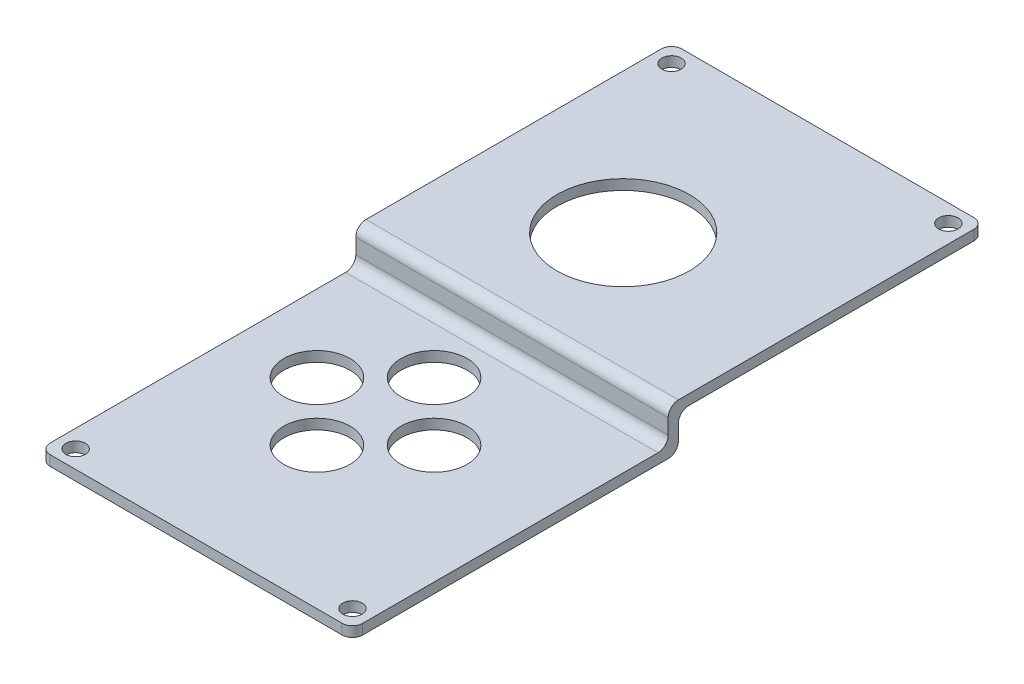
ISO-10303-21;
HEADER;
FILE_DESCRIPTION(('STEP AP214'),'2;1');
FILE_NAME('part.step','',(''),(''),'','','');
FILE_SCHEMA(('AUTOMOTIVE_DESIGN { 1 0 10303 214 1 1 1 1 }'));
ENDSEC;
DATA;
#1=APPLICATION_CONTEXT('core data for automotive mechanical design processes');
#2=APPLICATION_PROTOCOL_DEFINITION('international standard','automotive_design',2000,#1);
#3=PRODUCT_CONTEXT('',#1,'mechanical');
#4=PRODUCT('Part','Part','',(#3));
#5=PRODUCT_RELATED_PRODUCT_CATEGORY('part','',(#4));
#6=PRODUCT_DEFINITION_FORMATION('','',#4);
#7=PRODUCT_DEFINITION_CONTEXT('part definition',#1,'design');
#8=PRODUCT_DEFINITION('design','',#6,#7);
#9=PRODUCT_DEFINITION_SHAPE('','',#8);
#10=(LENGTH_UNIT() NAMED_UNIT(*) SI_UNIT(.MILLI.,.METRE.));
#11=(NAMED_UNIT(*) PLANE_ANGLE_UNIT() SI_UNIT($,.RADIAN.));
#12=(NAMED_UNIT(*) SI_UNIT($,.STERADIAN.) SOLID_ANGLE_UNIT());
#13=UNCERTAINTY_MEASURE_WITH_UNIT(LENGTH_MEASURE(1.E-05),#10,'distance_accuracy_value','');
#14=(GEOMETRIC_REPRESENTATION_CONTEXT(3) GLOBAL_UNCERTAINTY_ASSIGNED_CONTEXT((#13)) GLOBAL_UNIT_ASSIGNED_CONTEXT((#10,
#11,#12)) REPRESENTATION_CONTEXT('',''));
#15=CARTESIAN_POINT('',(0.,0.,0.));
#16=DIRECTION('',(0.,0.,1.));
#17=DIRECTION('',(1.,0.,0.));
#18=AXIS2_PLACEMENT_3D('',#15,#16,#17);
#19=CARTESIAN_POINT('',(61.34,0.,0.));
#20=DIRECTION('',(0.,0.,1.));
#21=DIRECTION('',(0.,-1.,0.));
#22=AXIS2_PLACEMENT_3D('',#19,#20,#21);
#23=PLANE('',#22);
#24=DIRECTION('',(0.,1.,0.));
#25=VECTOR('',#24,1.);
#26=CARTESIAN_POINT('',(0.,0.,0.));
#27=LINE('',#26,#25);
#28=CARTESIAN_POINT('',(0.,-5.,0.));
#29=VERTEX_POINT('',#28);
#30=CARTESIAN_POINT('',(0.,-2.,0.));
#31=VERTEX_POINT('',#30);
#32=EDGE_CURVE('E174',#29,#31,#27,.T.);
#33=ORIENTED_EDGE('',*,*,#32,.T.);
#34=DIRECTION('',(-1.,0.,0.));
#35=VECTOR('',#34,1.);
#36=CARTESIAN_POINT('',(61.34,-2.,0.));
#37=LINE('',#36,#35);
#38=CARTESIAN_POINT('',(61.34,-2.,0.));
#39=VERTEX_POINT('',#38);
#40=EDGE_CURVE('E151',#31,#39,#37,.F.);
#41=ORIENTED_EDGE('',*,*,#40,.T.);
#42=DIRECTION('',(0.,1.,0.));
#43=VECTOR('',#42,1.);
#44=CARTESIAN_POINT('',(61.34,0.,0.));
#45=LINE('',#44,#43);
#46=CARTESIAN_POINT('',(61.34,-5.,0.));
#47=VERTEX_POINT('',#46);
#48=EDGE_CURVE('E188',#47,#39,#45,.T.);
#49=ORIENTED_EDGE('',*,*,#48,.F.);
#50=DIRECTION('',(-1.,0.,0.));
#51=VECTOR('',#50,1.);
#52=CARTESIAN_POINT('',(61.34,-5.,0.));
#53=LINE('',#52,#51);
#54=EDGE_CURVE('E167',#47,#29,#53,.T.);
#55=ORIENTED_EDGE('',*,*,#54,.T.);
#56=EDGE_LOOP('',(#33,#41,#49,#55));
#57=FACE_BOUND('',#56,.T.);
#58=ADVANCED_FACE('F32',(#57),#23,.F.);
#59=CARTESIAN_POINT('',(61.34,0.,0.));
#60=DIRECTION('',(0.,1.,0.));
#61=DIRECTION('',(0.,0.,1.));
#62=AXIS2_PLACEMENT_3D('',#59,#60,#61);
#63=PLANE('',#62);
#64=CARTESIAN_POINT('',(27.5,0.,-23.));
#65=DIRECTION('',(0.,1.,0.));
#66=DIRECTION('',(0.,0.,1.));
#67=AXIS2_PLACEMENT_3D('',#64,#65,#66);
#68=CIRCLE('',#67,13.);
#69=CARTESIAN_POINT('',(27.5,0.,-10.));
#70=VERTEX_POINT('',#69);
#71=EDGE_CURVE('E178',#70,#70,#68,.T.);
#72=ORIENTED_EDGE('',*,*,#71,.T.);
#73=EDGE_LOOP('',(#72));
#74=FACE_BOUND('',#73,.T.);
#75=CARTESIAN_POINT('',(57.84,0.,-56.5));
#76=DIRECTION('',(0.,1.,0.));
#77=DIRECTION('',(0.,0.,1.));
#78=AXIS2_PLACEMENT_3D('',#75,#76,#77);
#79=CIRCLE('',#78,1.9);
#80=CARTESIAN_POINT('',(57.84,0.,-54.6));
#81=VERTEX_POINT('',#80);
#82=EDGE_CURVE('E572',#81,#81,#79,.T.);
#83=ORIENTED_EDGE('',*,*,#82,.T.);
#84=EDGE_LOOP('',(#83));
#85=FACE_BOUND('',#84,.T.);
#86=CARTESIAN_POINT('',(3.5,0.,-56.5));
#87=DIRECTION('',(0.,1.,0.));
#88=DIRECTION('',(0.,0.,1.));
#89=AXIS2_PLACEMENT_3D('',#86,#87,#88);
#90=CIRCLE('',#89,1.9);
#91=CARTESIAN_POINT('',(3.5,0.,-54.6));
#92=VERTEX_POINT('',#91);
#93=EDGE_CURVE('E570',#92,#92,#90,.T.);
#94=ORIENTED_EDGE('',*,*,#93,.T.);
#95=EDGE_LOOP('',(#94));
#96=FACE_BOUND('',#95,.T.);
#97=DIRECTION('',(-1.,0.,0.));
#98=VECTOR('',#97,1.);
#99=CARTESIAN_POINT('',(61.34,0.,-60.));
#100=LINE('',#99,#98);
#101=CARTESIAN_POINT('',(59.34,0.,-60.));
#102=VERTEX_POINT('',#101);
#103=CARTESIAN_POINT('',(2.,0.,-60.));
#104=VERTEX_POINT('',#103);
#105=EDGE_CURVE('E168',#102,#104,#100,.T.);
#106=ORIENTED_EDGE('',*,*,#105,.F.);
#107=CARTESIAN_POINT('',(59.34,0.,-58.));
#108=DIRECTION('',(0.,1.,0.));
#109=DIRECTION('',(0.,0.,1.));
#110=AXIS2_PLACEMENT_3D('',#107,#108,#109);
#111=CIRCLE('',#110,2.);
#112=CARTESIAN_POINT('',(61.34,0.,-58.));
#113=VERTEX_POINT('',#112);
#114=EDGE_CURVE('E248',#102,#113,#111,.F.);
#115=ORIENTED_EDGE('',*,*,#114,.T.);
#116=DIRECTION('',(0.,0.,-1.));
#117=VECTOR('',#116,1.);
#118=CARTESIAN_POINT('',(61.34,0.,0.));
#119=LINE('',#118,#117);
#120=CARTESIAN_POINT('',(61.34,0.,-2.));
#121=VERTEX_POINT('',#120);
#122=EDGE_CURVE('E166',#121,#113,#119,.T.);
#123=ORIENTED_EDGE('',*,*,#122,.F.);
#124=DIRECTION('',(-1.,0.,0.));
#125=VECTOR('',#124,1.);
#126=CARTESIAN_POINT('',(0.,0.,-2.));
#127=LINE('',#126,#125);
#128=CARTESIAN_POINT('',(0.,0.,-2.));
#129=VERTEX_POINT('',#128);
#130=EDGE_CURVE('E150',#121,#129,#127,.T.);
#131=ORIENTED_EDGE('',*,*,#130,.T.);
#132=DIRECTION('',(0.,0.,-1.));
#133=VECTOR('',#132,1.);
#134=CARTESIAN_POINT('',(0.,0.,0.));
#135=LINE('',#134,#133);
#136=CARTESIAN_POINT('',(0.,0.,-58.));
#137=VERTEX_POINT('',#136);
#138=EDGE_CURVE('E163',#129,#137,#135,.T.);
#139=ORIENTED_EDGE('',*,*,#138,.T.);
#140=CARTESIAN_POINT('',(2.,0.,-58.));
#141=DIRECTION('',(0.,1.,0.));
#142=DIRECTION('',(0.,0.,1.));
#143=AXIS2_PLACEMENT_3D('',#140,#141,#142);
#144=CIRCLE('',#143,2.);
#145=EDGE_CURVE('E246',#137,#104,#144,.F.);
#146=ORIENTED_EDGE('',*,*,#145,.T.);
#147=EDGE_LOOP('',(#106,#115,#123,#131,#139,#146));
#148=FACE_BOUND('',#147,.T.);
#149=ADVANCED_FACE('F162',(#74,#85,#96,#148),#63,.F.);
#150=CARTESIAN_POINT('',(61.34,0.,-60.));
#151=DIRECTION('',(0.,0.,1.));
#152=DIRECTION('',(1.,0.,0.));
#153=AXIS2_PLACEMENT_3D('',#150,#151,#152);
#154=PLANE('',#153);
#155=DIRECTION('',(-1.,0.,0.));
#156=VECTOR('',#155,1.);
#157=CARTESIAN_POINT('',(61.34,2.,-60.));
#158=LINE('',#157,#156);
#159=CARTESIAN_POINT('',(59.34,2.,-60.));
#160=VERTEX_POINT('',#159);
#161=CARTESIAN_POINT('',(2.,2.,-60.));
#162=VERTEX_POINT('',#161);
#163=EDGE_CURVE('E195',#160,#162,#158,.T.);
#164=ORIENTED_EDGE('',*,*,#163,.F.);
#165=DIRECTION('',(0.,1.,0.));
#166=VECTOR('',#165,1.);
#167=CARTESIAN_POINT('',(59.34,0.,-60.));
#168=LINE('',#167,#166);
#169=EDGE_CURVE('E244',#160,#102,#168,.F.);
#170=ORIENTED_EDGE('',*,*,#169,.T.);
#171=ORIENTED_EDGE('',*,*,#105,.T.);
#172=DIRECTION('',(0.,1.,0.));
#173=VECTOR('',#172,1.);
#174=CARTESIAN_POINT('',(2.,2.,-60.));
#175=LINE('',#174,#173);
#176=EDGE_CURVE('E241',#104,#162,#175,.T.);
#177=ORIENTED_EDGE('',*,*,#176,.T.);
#178=EDGE_LOOP('',(#164,#170,#171,#177));
#179=FACE_BOUND('',#178,.T.);
#180=ADVANCED_FACE('F319',(#179),#154,.F.);
#181=CARTESIAN_POINT('',(61.34,2.,-60.));
#182=DIRECTION('',(0.,-1.,0.));
#183=DIRECTION('',(0.,0.,-1.));
#184=AXIS2_PLACEMENT_3D('',#181,#182,#183);
#185=PLANE('',#184);
#186=CARTESIAN_POINT('',(27.5,2.,-23.));
#187=DIRECTION('',(0.,1.,0.));
#188=DIRECTION('',(0.,0.,1.));
#189=AXIS2_PLACEMENT_3D('',#186,#187,#188);
#190=CIRCLE('',#189,13.);
#191=CARTESIAN_POINT('',(27.5,1.99999999999999,-10.));
#192=VERTEX_POINT('',#191);
#193=EDGE_CURVE('E573',#192,#192,#190,.T.);
#194=ORIENTED_EDGE('',*,*,#193,.F.);
#195=EDGE_LOOP('',(#194));
#196=FACE_BOUND('',#195,.T.);
#197=CARTESIAN_POINT('',(57.84,2.,-56.5));
#198=DIRECTION('',(0.,1.,0.));
#199=DIRECTION('',(0.,0.,1.));
#200=AXIS2_PLACEMENT_3D('',#197,#198,#199);
#201=CIRCLE('',#200,1.9);
#202=CARTESIAN_POINT('',(57.84,2.,-54.6));
#203=VERTEX_POINT('',#202);
#204=EDGE_CURVE('E577',#203,#203,#201,.T.);
#205=ORIENTED_EDGE('',*,*,#204,.F.);
#206=EDGE_LOOP('',(#205));
#207=FACE_BOUND('',#206,.T.);
#208=CARTESIAN_POINT('',(3.5,2.,-56.5));
#209=DIRECTION('',(0.,1.,0.));
#210=DIRECTION('',(0.,0.,1.));
#211=AXIS2_PLACEMENT_3D('',#208,#209,#210);
#212=CIRCLE('',#211,1.9);
#213=CARTESIAN_POINT('',(3.5,2.,-54.6));
#214=VERTEX_POINT('',#213);
#215=EDGE_CURVE('E567',#214,#214,#212,.T.);
#216=ORIENTED_EDGE('',*,*,#215,.F.);
#217=EDGE_LOOP('',(#216));
#218=FACE_BOUND('',#217,.T.);
#219=DIRECTION('',(0.,0.,1.));
#220=VECTOR('',#219,1.);
#221=CARTESIAN_POINT('',(61.34,2.,-60.));
#222=LINE('',#221,#220);
#223=CARTESIAN_POINT('',(61.34,2.,-58.));
#224=VERTEX_POINT('',#223);
#225=CARTESIAN_POINT('',(61.34,1.99999999999999,0.));
#226=VERTEX_POINT('',#225);
#227=EDGE_CURVE('E295',#224,#226,#222,.T.);
#228=ORIENTED_EDGE('',*,*,#227,.F.);
#229=CARTESIAN_POINT('',(59.34,2.,-58.));
#230=DIRECTION('',(0.,-1.,0.));
#231=DIRECTION('',(0.,0.,-1.));
#232=AXIS2_PLACEMENT_3D('',#229,#230,#231);
#233=CIRCLE('',#232,2.);
#234=EDGE_CURVE('E239',#224,#160,#233,.F.);
#235=ORIENTED_EDGE('',*,*,#234,.T.);
#236=ORIENTED_EDGE('',*,*,#163,.T.);
#237=CARTESIAN_POINT('',(2.,2.,-58.));
#238=DIRECTION('',(0.,-1.,0.));
#239=DIRECTION('',(0.,0.,-1.));
#240=AXIS2_PLACEMENT_3D('',#237,#238,#239);
#241=CIRCLE('',#240,2.);
#242=CARTESIAN_POINT('',(0.,2.,-58.));
#243=VERTEX_POINT('',#242);
#244=EDGE_CURVE('E237',#162,#243,#241,.F.);
#245=ORIENTED_EDGE('',*,*,#244,.T.);
#246=DIRECTION('',(0.,0.,1.));
#247=VECTOR('',#246,1.);
#248=CARTESIAN_POINT('',(0.,2.,-60.));
#249=LINE('',#248,#247);
#250=CARTESIAN_POINT('',(0.,1.99999999999999,0.));
#251=VERTEX_POINT('',#250);
#252=EDGE_CURVE('E173',#243,#251,#249,.T.);
#253=ORIENTED_EDGE('',*,*,#252,.T.);
#254=DIRECTION('',(-1.,0.,0.));
#255=VECTOR('',#254,1.);
#256=CARTESIAN_POINT('',(61.34,1.99999999999999,0.));
#257=LINE('',#256,#255);
#258=EDGE_CURVE('E221',#251,#226,#257,.F.);
#259=ORIENTED_EDGE('',*,*,#258,.T.);
#260=EDGE_LOOP('',(#228,#235,#236,#245,#253,#259));
#261=FACE_BOUND('',#260,.T.);
#262=ADVANCED_FACE('F325',(#196,#207,#218,#261),#185,.F.);
#263=CARTESIAN_POINT('',(61.34,1.99999999999999,2.));
#264=DIRECTION('',(0.,0.,-1.));
#265=DIRECTION('',(0.,1.,0.));
#266=AXIS2_PLACEMENT_3D('',#263,#264,#265);
#267=PLANE('',#266);
#268=DIRECTION('',(0.,-1.,0.));
#269=VECTOR('',#268,1.);
#270=CARTESIAN_POINT('',(61.34,1.99999999999999,2.));
#271=LINE('',#270,#269);
#272=CARTESIAN_POINT('',(61.34,0.,2.));
#273=VERTEX_POINT('',#272);
#274=CARTESIAN_POINT('',(61.34,-3.,2.));
#275=VERTEX_POINT('',#274);
#276=EDGE_CURVE('E275',#273,#275,#271,.T.);
#277=ORIENTED_EDGE('',*,*,#276,.F.);
#278=DIRECTION('',(-1.,0.,0.));
#279=VECTOR('',#278,1.);
#280=CARTESIAN_POINT('',(61.34,0.,2.));
#281=LINE('',#280,#279);
#282=CARTESIAN_POINT('',(0.,0.,2.));
#283=VERTEX_POINT('',#282);
#284=EDGE_CURVE('E218',#273,#283,#281,.T.);
#285=ORIENTED_EDGE('',*,*,#284,.T.);
#286=DIRECTION('',(0.,-1.,0.));
#287=VECTOR('',#286,1.);
#288=CARTESIAN_POINT('',(0.,1.99999999999999,2.));
#289=LINE('',#288,#287);
#290=CARTESIAN_POINT('',(0.,-3.,2.));
#291=VERTEX_POINT('',#290);
#292=EDGE_CURVE('E176',#283,#291,#289,.T.);
#293=ORIENTED_EDGE('',*,*,#292,.T.);
#294=DIRECTION('',(-1.,0.,0.));
#295=VECTOR('',#294,1.);
#296=CARTESIAN_POINT('',(61.34,-3.,2.));
#297=LINE('',#296,#295);
#298=EDGE_CURVE('E216',#291,#275,#297,.F.);
#299=ORIENTED_EDGE('',*,*,#298,.T.);
#300=EDGE_LOOP('',(#277,#285,#293,#299));
#301=FACE_BOUND('',#300,.T.);
#302=ADVANCED_FACE('F309',(#301),#267,.F.);
#303=CARTESIAN_POINT('',(61.34,-5.,2.));
#304=DIRECTION('',(0.,-1.,0.));
#305=DIRECTION('',(0.,0.,-1.));
#306=AXIS2_PLACEMENT_3D('',#303,#304,#305);
#307=PLANE('',#306);
#308=CARTESIAN_POINT('',(3.5,-5.00000000000001,60.5));
#309=DIRECTION('',(0.,1.,0.));
#310=DIRECTION('',(0.,0.,1.));
#311=AXIS2_PLACEMENT_3D('',#308,#309,#310);
#312=CIRCLE('',#311,1.9);
#313=CARTESIAN_POINT('',(3.5,-5.00000000000001,62.4));
#314=VERTEX_POINT('',#313);
#315=EDGE_CURVE('E590',#314,#314,#312,.T.);
#316=ORIENTED_EDGE('',*,*,#315,.F.);
#317=EDGE_LOOP('',(#316));
#318=FACE_BOUND('',#317,.T.);
#319=CARTESIAN_POINT('',(15.07,-5.,24.7));
#320=DIRECTION('',(0.,1.,0.));
#321=DIRECTION('',(0.,0.,1.));
#322=AXIS2_PLACEMENT_3D('',#319,#320,#321);
#323=CIRCLE('',#322,6.5);
#324=CARTESIAN_POINT('',(15.07,-5.,31.2));
#325=VERTEX_POINT('',#324);
#326=EDGE_CURVE('E603',#325,#325,#323,.T.);
#327=ORIENTED_EDGE('',*,*,#326,.F.);
#328=EDGE_LOOP('',(#327));
#329=FACE_BOUND('',#328,.T.);
#330=CARTESIAN_POINT('',(26.57,-5.00000000000001,36.2));
#331=DIRECTION('',(0.,1.,0.));
#332=DIRECTION('',(0.,0.,1.));
#333=AXIS2_PLACEMENT_3D('',#330,#331,#332);
#334=CIRCLE('',#333,6.5);
#335=CARTESIAN_POINT('',(26.57,-5.00000000000001,42.7));
#336=VERTEX_POINT('',#335);
#337=EDGE_CURVE('E597',#336,#336,#334,.T.);
#338=ORIENTED_EDGE('',*,*,#337,.F.);
#339=EDGE_LOOP('',(#338));
#340=FACE_BOUND('',#339,.T.);
#341=CARTESIAN_POINT('',(26.57,-5.,13.2));
#342=DIRECTION('',(0.,1.,0.));
#343=DIRECTION('',(0.,0.,1.));
#344=AXIS2_PLACEMENT_3D('',#341,#342,#343);
#345=CIRCLE('',#344,6.50000000000001);
#346=CARTESIAN_POINT('',(26.57,-5.,19.7));
#347=VERTEX_POINT('',#346);
#348=EDGE_CURVE('E614',#347,#347,#345,.T.);
#349=ORIENTED_EDGE('',*,*,#348,.F.);
#350=EDGE_LOOP('',(#349));
#351=FACE_BOUND('',#350,.T.);
#352=CARTESIAN_POINT('',(57.84,-5.00000000000001,60.5));
#353=DIRECTION('',(0.,1.,0.));
#354=DIRECTION('',(0.,0.,1.));
#355=AXIS2_PLACEMENT_3D('',#352,#353,#354);
#356=CIRCLE('',#355,1.9);
#357=CARTESIAN_POINT('',(57.84,-5.00000000000001,62.4));
#358=VERTEX_POINT('',#357);
#359=EDGE_CURVE('E596',#358,#358,#356,.T.);
#360=ORIENTED_EDGE('',*,*,#359,.F.);
#361=EDGE_LOOP('',(#360));
#362=FACE_BOUND('',#361,.T.);
#363=CARTESIAN_POINT('',(38.07,-5.,24.7));
#364=DIRECTION('',(0.,1.,0.));
#365=DIRECTION('',(0.,0.,1.));
#366=AXIS2_PLACEMENT_3D('',#363,#364,#365);
#367=CIRCLE('',#366,6.5);
#368=CARTESIAN_POINT('',(38.07,-5.,31.2));
#369=VERTEX_POINT('',#368);
#370=EDGE_CURVE('E584',#369,#369,#367,.T.);
#371=ORIENTED_EDGE('',*,*,#370,.F.);
#372=EDGE_LOOP('',(#371));
#373=FACE_BOUND('',#372,.T.);
#374=DIRECTION('',(-1.,0.,0.));
#375=VECTOR('',#374,1.);
#376=CARTESIAN_POINT('',(61.34,-5.00000000000001,64.));
#377=LINE('',#376,#375);
#378=CARTESIAN_POINT('',(59.34,-5.00000000000001,64.));
#379=VERTEX_POINT('',#378);
#380=CARTESIAN_POINT('',(2.,-5.00000000000001,64.));
#381=VERTEX_POINT('',#380);
#382=EDGE_CURVE('E192',#379,#381,#377,.T.);
#383=ORIENTED_EDGE('',*,*,#382,.F.);
#384=CARTESIAN_POINT('',(59.34,-5.00000000000001,62.));
#385=DIRECTION('',(0.,-1.,0.));
#386=DIRECTION('',(0.,0.,-1.));
#387=AXIS2_PLACEMENT_3D('',#384,#385,#386);
#388=CIRCLE('',#387,2.);
#389=CARTESIAN_POINT('',(61.34,-5.00000000000001,62.));
#390=VERTEX_POINT('',#389);
#391=EDGE_CURVE('E260',#379,#390,#388,.F.);
#392=ORIENTED_EDGE('',*,*,#391,.T.);
#393=DIRECTION('',(0.,0.,1.));
#394=VECTOR('',#393,1.);
#395=CARTESIAN_POINT('',(61.34,-5.,2.));
#396=LINE('',#395,#394);
#397=CARTESIAN_POINT('',(61.34,-5.,4.));
#398=VERTEX_POINT('',#397);
#399=EDGE_CURVE('E265',#398,#390,#396,.T.);
#400=ORIENTED_EDGE('',*,*,#399,.F.);
#401=DIRECTION('',(-1.,0.,0.));
#402=VECTOR('',#401,1.);
#403=CARTESIAN_POINT('',(0.,-5.,4.));
#404=LINE('',#403,#402);
#405=CARTESIAN_POINT('',(0.,-5.,4.));
#406=VERTEX_POINT('',#405);
#407=EDGE_CURVE('E156',#398,#406,#404,.T.);
#408=ORIENTED_EDGE('',*,*,#407,.T.);
#409=DIRECTION('',(0.,0.,1.));
#410=VECTOR('',#409,1.);
#411=CARTESIAN_POINT('',(0.,-5.,2.));
#412=LINE('',#411,#410);
#413=CARTESIAN_POINT('',(0.,-5.00000000000001,62.));
#414=VERTEX_POINT('',#413);
#415=EDGE_CURVE('E184',#406,#414,#412,.T.);
#416=ORIENTED_EDGE('',*,*,#415,.T.);
#417=CARTESIAN_POINT('',(2.,-5.00000000000001,62.));
#418=DIRECTION('',(0.,-1.,0.));
#419=DIRECTION('',(0.,0.,-1.));
#420=AXIS2_PLACEMENT_3D('',#417,#418,#419);
#421=CIRCLE('',#420,2.);
#422=EDGE_CURVE('E52',#414,#381,#421,.F.);
#423=ORIENTED_EDGE('',*,*,#422,.T.);
#424=EDGE_LOOP('',(#383,#392,#400,#408,#416,#423));
#425=FACE_BOUND('',#424,.T.);
#426=ADVANCED_FACE('F264',(#318,#329,#340,#351,#362,#373,#425),#307,.F.);
#427=CARTESIAN_POINT('',(61.34,-5.00000000000001,64.));
#428=DIRECTION('',(0.,0.,-1.));
#429=DIRECTION('',(-1.,0.,0.));
#430=AXIS2_PLACEMENT_3D('',#427,#428,#429);
#431=PLANE('',#430);
#432=DIRECTION('',(-1.,0.,0.));
#433=VECTOR('',#432,1.);
#434=CARTESIAN_POINT('',(61.34,-7.00000000000001,64.));
#435=LINE('',#434,#433);
#436=CARTESIAN_POINT('',(59.34,-7.00000000000001,64.));
#437=VERTEX_POINT('',#436);
#438=CARTESIAN_POINT('',(2.,-7.00000000000001,64.));
#439=VERTEX_POINT('',#438);
#440=EDGE_CURVE('E189',#437,#439,#435,.T.);
#441=ORIENTED_EDGE('',*,*,#440,.F.);
#442=DIRECTION('',(0.,-1.,0.));
#443=VECTOR('',#442,1.);
#444=CARTESIAN_POINT('',(59.34,-5.00000000000001,64.));
#445=LINE('',#444,#443);
#446=EDGE_CURVE('E257',#437,#379,#445,.F.);
#447=ORIENTED_EDGE('',*,*,#446,.T.);
#448=ORIENTED_EDGE('',*,*,#382,.T.);
#449=DIRECTION('',(0.,-1.,0.));
#450=VECTOR('',#449,1.);
#451=CARTESIAN_POINT('',(2.,-7.00000000000001,64.));
#452=LINE('',#451,#450);
#453=EDGE_CURVE('E254',#381,#439,#452,.T.);
#454=ORIENTED_EDGE('',*,*,#453,.T.);
#455=EDGE_LOOP('',(#441,#447,#448,#454));
#456=FACE_BOUND('',#455,.T.);
#457=ADVANCED_FACE('F282',(#456),#431,.F.);
#458=CARTESIAN_POINT('',(61.34,-7.,0.));
#459=DIRECTION('',(0.,1.,0.));
#460=DIRECTION('',(0.,0.,1.));
#461=AXIS2_PLACEMENT_3D('',#458,#459,#460);
#462=PLANE('',#461);
#463=CARTESIAN_POINT('',(3.5,-7.00000000000002,60.5));
#464=DIRECTION('',(0.,1.,0.));
#465=DIRECTION('',(0.,0.,1.));
#466=AXIS2_PLACEMENT_3D('',#463,#464,#465);
#467=CIRCLE('',#466,1.9);
#468=CARTESIAN_POINT('',(3.5,-7.00000000000002,62.4));
#469=VERTEX_POINT('',#468);
#470=EDGE_CURVE('E593',#469,#469,#467,.T.);
#471=ORIENTED_EDGE('',*,*,#470,.T.);
#472=EDGE_LOOP('',(#471));
#473=FACE_BOUND('',#472,.T.);
#474=CARTESIAN_POINT('',(15.07,-7.00000000000002,24.7));
#475=DIRECTION('',(0.,1.,0.));
#476=DIRECTION('',(0.,0.,1.));
#477=AXIS2_PLACEMENT_3D('',#474,#475,#476);
#478=CIRCLE('',#477,6.5);
#479=CARTESIAN_POINT('',(15.07,-7.00000000000002,31.2));
#480=VERTEX_POINT('',#479);
#481=EDGE_CURVE('E600',#480,#480,#478,.T.);
#482=ORIENTED_EDGE('',*,*,#481,.T.);
#483=EDGE_LOOP('',(#482));
#484=FACE_BOUND('',#483,.T.);
#485=CARTESIAN_POINT('',(26.57,-7.00000000000002,36.2));
#486=DIRECTION('',(0.,1.,0.));
#487=DIRECTION('',(0.,0.,1.));
#488=AXIS2_PLACEMENT_3D('',#485,#486,#487);
#489=CIRCLE('',#488,6.5);
#490=CARTESIAN_POINT('',(26.57,-7.00000000000002,42.7));
#491=VERTEX_POINT('',#490);
#492=EDGE_CURVE('E587',#491,#491,#489,.T.);
#493=ORIENTED_EDGE('',*,*,#492,.T.);
#494=EDGE_LOOP('',(#493));
#495=FACE_BOUND('',#494,.T.);
#496=CARTESIAN_POINT('',(26.57,-7.00000000000002,13.2));
#497=DIRECTION('',(0.,1.,0.));
#498=DIRECTION('',(0.,0.,1.));
#499=AXIS2_PLACEMENT_3D('',#496,#497,#498);
#500=CIRCLE('',#499,6.50000000000001);
#501=CARTESIAN_POINT('',(26.57,-7.00000000000002,19.7));
#502=VERTEX_POINT('',#501);
#503=EDGE_CURVE('E606',#502,#502,#500,.T.);
#504=ORIENTED_EDGE('',*,*,#503,.T.);
#505=EDGE_LOOP('',(#504));
#506=FACE_BOUND('',#505,.T.);
#507=CARTESIAN_POINT('',(57.84,-7.00000000000002,60.5));
#508=DIRECTION('',(0.,1.,0.));
#509=DIRECTION('',(0.,0.,1.));
#510=AXIS2_PLACEMENT_3D('',#507,#508,#509);
#511=CIRCLE('',#510,1.9);
#512=CARTESIAN_POINT('',(57.84,-7.00000000000002,62.4));
#513=VERTEX_POINT('',#512);
#514=EDGE_CURVE('E611',#513,#513,#511,.T.);
#515=ORIENTED_EDGE('',*,*,#514,.T.);
#516=EDGE_LOOP('',(#515));
#517=FACE_BOUND('',#516,.T.);
#518=CARTESIAN_POINT('',(38.07,-7.00000000000002,24.7));
#519=DIRECTION('',(0.,1.,0.));
#520=DIRECTION('',(0.,0.,1.));
#521=AXIS2_PLACEMENT_3D('',#518,#519,#520);
#522=CIRCLE('',#521,6.5);
#523=CARTESIAN_POINT('',(38.07,-7.00000000000002,31.2));
#524=VERTEX_POINT('',#523);
#525=EDGE_CURVE('E581',#524,#524,#522,.T.);
#526=ORIENTED_EDGE('',*,*,#525,.T.);
#527=EDGE_LOOP('',(#526));
#528=FACE_BOUND('',#527,.T.);
#529=DIRECTION('',(0.,0.,-1.));
#530=VECTOR('',#529,1.);
#531=CARTESIAN_POINT('',(61.34,-7.,0.));
#532=LINE('',#531,#530);
#533=CARTESIAN_POINT('',(61.34,-7.00000000000001,62.));
#534=VERTEX_POINT('',#533);
#535=CARTESIAN_POINT('',(61.34,-7.,2.));
#536=VERTEX_POINT('',#535);
#537=EDGE_CURVE('E193',#534,#536,#532,.T.);
#538=ORIENTED_EDGE('',*,*,#537,.F.);
#539=CARTESIAN_POINT('',(59.34,-7.00000000000001,62.));
#540=DIRECTION('',(0.,1.,0.));
#541=DIRECTION('',(0.,0.,1.));
#542=AXIS2_PLACEMENT_3D('',#539,#540,#541);
#543=CIRCLE('',#542,2.);
#544=EDGE_CURVE('E252',#534,#437,#543,.F.);
#545=ORIENTED_EDGE('',*,*,#544,.T.);
#546=ORIENTED_EDGE('',*,*,#440,.T.);
#547=CARTESIAN_POINT('',(2.,-7.00000000000001,62.));
#548=DIRECTION('',(0.,1.,0.));
#549=DIRECTION('',(0.,0.,1.));
#550=AXIS2_PLACEMENT_3D('',#547,#548,#549);
#551=CIRCLE('',#550,2.);
#552=CARTESIAN_POINT('',(0.,-7.00000000000001,62.));
#553=VERTEX_POINT('',#552);
#554=EDGE_CURVE('E250',#439,#553,#551,.F.);
#555=ORIENTED_EDGE('',*,*,#554,.T.);
#556=DIRECTION('',(0.,0.,-1.));
#557=VECTOR('',#556,1.);
#558=CARTESIAN_POINT('',(0.,-7.,0.));
#559=LINE('',#558,#557);
#560=CARTESIAN_POINT('',(0.,-7.,2.));
#561=VERTEX_POINT('',#560);
#562=EDGE_CURVE('E186',#553,#561,#559,.T.);
#563=ORIENTED_EDGE('',*,*,#562,.T.);
#564=DIRECTION('',(-1.,0.,0.));
#565=VECTOR('',#564,1.);
#566=CARTESIAN_POINT('',(61.34,-7.,2.));
#567=LINE('',#566,#565);
#568=EDGE_CURVE('E209',#561,#536,#567,.F.);
#569=ORIENTED_EDGE('',*,*,#568,.T.);
#570=EDGE_LOOP('',(#538,#545,#546,#555,#563,#569));
#571=FACE_BOUND('',#570,.T.);
#572=ADVANCED_FACE('F280',(#473,#484,#495,#506,#517,#528,#571),#462,.F.);
#573=CARTESIAN_POINT('',(61.34,0.,0.));
#574=DIRECTION('',(-1.,0.,0.));
#575=DIRECTION('',(0.,0.,1.));
#576=AXIS2_PLACEMENT_3D('',#573,#574,#575);
#577=PLANE('',#576);
#578=ORIENTED_EDGE('',*,*,#122,.T.);
#579=DIRECTION('',(0.,1.,0.));
#580=VECTOR('',#579,1.);
#581=CARTESIAN_POINT('',(61.34,0.,-58.));
#582=LINE('',#581,#580);
#583=EDGE_CURVE('E234',#113,#224,#582,.T.);
#584=ORIENTED_EDGE('',*,*,#583,.T.);
#585=ORIENTED_EDGE('',*,*,#227,.T.);
#586=CARTESIAN_POINT('',(61.34,0.,0.));
#587=DIRECTION('',(-1.,0.,0.));
#588=DIRECTION('',(0.,0.,1.));
#589=AXIS2_PLACEMENT_3D('',#586,#587,#588);
#590=CIRCLE('',#589,2.);
#591=EDGE_CURVE('E212',#226,#273,#590,.F.);
#592=ORIENTED_EDGE('',*,*,#591,.T.);
#593=ORIENTED_EDGE('',*,*,#276,.T.);
#594=CARTESIAN_POINT('',(61.34,-3.,4.));
#595=DIRECTION('',(-1.,0.,0.));
#596=DIRECTION('',(0.,0.,1.));
#597=AXIS2_PLACEMENT_3D('',#594,#595,#596);
#598=CIRCLE('',#597,2.);
#599=EDGE_CURVE('E229',#275,#398,#598,.T.);
#600=ORIENTED_EDGE('',*,*,#599,.T.);
#601=ORIENTED_EDGE('',*,*,#399,.T.);
#602=DIRECTION('',(0.,-1.,0.));
#603=VECTOR('',#602,1.);
#604=CARTESIAN_POINT('',(61.34,0.,62.));
#605=LINE('',#604,#603);
#606=EDGE_CURVE('E231',#390,#534,#605,.T.);
#607=ORIENTED_EDGE('',*,*,#606,.T.);
#608=ORIENTED_EDGE('',*,*,#537,.T.);
#609=CARTESIAN_POINT('',(61.34,-5.,2.));
#610=DIRECTION('',(-1.,0.,0.));
#611=DIRECTION('',(0.,0.,1.));
#612=AXIS2_PLACEMENT_3D('',#609,#610,#611);
#613=CIRCLE('',#612,2.);
#614=EDGE_CURVE('E214',#536,#47,#613,.F.);
#615=ORIENTED_EDGE('',*,*,#614,.T.);
#616=ORIENTED_EDGE('',*,*,#48,.T.);
#617=CARTESIAN_POINT('',(61.34,-2.,-2.));
#618=DIRECTION('',(-1.,0.,0.));
#619=DIRECTION('',(0.,0.,1.));
#620=AXIS2_PLACEMENT_3D('',#617,#618,#619);
#621=CIRCLE('',#620,2.);
#622=EDGE_CURVE('E155',#39,#121,#621,.T.);
#623=ORIENTED_EDGE('',*,*,#622,.T.);
#624=EDGE_LOOP('',(#578,#584,#585,#592,#593,#600,#601,#607,#608,#615,#616,#623));
#625=FACE_BOUND('',#624,.T.);
#626=ADVANCED_FACE('F271',(#625),#577,.F.);
#627=CARTESIAN_POINT('',(0.,0.,0.));
#628=DIRECTION('',(-1.,0.,0.));
#629=DIRECTION('',(0.,0.,1.));
#630=AXIS2_PLACEMENT_3D('',#627,#628,#629);
#631=PLANE('',#630);
#632=ORIENTED_EDGE('',*,*,#562,.F.);
#633=DIRECTION('',(0.,-1.,0.));
#634=VECTOR('',#633,1.);
#635=CARTESIAN_POINT('',(0.,-5.00000000000001,62.));
#636=LINE('',#635,#634);
#637=EDGE_CURVE('E11',#553,#414,#636,.F.);
#638=ORIENTED_EDGE('',*,*,#637,.T.);
#639=ORIENTED_EDGE('',*,*,#415,.F.);
#640=CARTESIAN_POINT('',(0.,-3.,4.));
#641=DIRECTION('',(-1.,0.,0.));
#642=DIRECTION('',(0.,0.,1.));
#643=AXIS2_PLACEMENT_3D('',#640,#641,#642);
#644=CIRCLE('',#643,2.);
#645=EDGE_CURVE('E227',#406,#291,#644,.F.);
#646=ORIENTED_EDGE('',*,*,#645,.T.);
#647=ORIENTED_EDGE('',*,*,#292,.F.);
#648=CARTESIAN_POINT('',(0.,0.,0.));
#649=DIRECTION('',(-1.,0.,0.));
#650=DIRECTION('',(0.,0.,1.));
#651=AXIS2_PLACEMENT_3D('',#648,#649,#650);
#652=CIRCLE('',#651,2.);
#653=EDGE_CURVE('E203',#283,#251,#652,.T.);
#654=ORIENTED_EDGE('',*,*,#653,.T.);
#655=ORIENTED_EDGE('',*,*,#252,.F.);
#656=DIRECTION('',(0.,1.,0.));
#657=VECTOR('',#656,1.);
#658=CARTESIAN_POINT('',(0.,0.,-58.));
#659=LINE('',#658,#657);
#660=EDGE_CURVE('E40',#243,#137,#659,.F.);
#661=ORIENTED_EDGE('',*,*,#660,.T.);
#662=ORIENTED_EDGE('',*,*,#138,.F.);
#663=CARTESIAN_POINT('',(0.,-2.,-2.));
#664=DIRECTION('',(-1.,0.,0.));
#665=DIRECTION('',(0.,0.,1.));
#666=AXIS2_PLACEMENT_3D('',#663,#664,#665);
#667=CIRCLE('',#666,2.);
#668=EDGE_CURVE('E146',#129,#31,#667,.F.);
#669=ORIENTED_EDGE('',*,*,#668,.T.);
#670=ORIENTED_EDGE('',*,*,#32,.F.);
#671=CARTESIAN_POINT('',(0.,-5.,2.));
#672=DIRECTION('',(-1.,0.,0.));
#673=DIRECTION('',(0.,0.,1.));
#674=AXIS2_PLACEMENT_3D('',#671,#672,#673);
#675=CIRCLE('',#674,2.);
#676=EDGE_CURVE('E206',#29,#561,#675,.T.);
#677=ORIENTED_EDGE('',*,*,#676,.T.);
#678=EDGE_LOOP('',(#632,#638,#639,#646,#647,#654,#655,#661,#662,#669,#670,#677));
#679=FACE_BOUND('',#678,.T.);
#680=ADVANCED_FACE('F170',(#679),#631,.T.);
#681=CARTESIAN_POINT('',(3.5,-7.00000000000001,-56.5));
#682=DIRECTION('',(0.,1.,0.));
#683=DIRECTION('',(0.,0.,1.));
#684=AXIS2_PLACEMENT_3D('',#681,#682,#683);
#685=CYLINDRICAL_SURFACE('',#684,1.9);
#686=ORIENTED_EDGE('',*,*,#215,.T.);
#687=EDGE_LOOP('',(#686));
#688=FACE_BOUND('',#687,.T.);
#689=ORIENTED_EDGE('',*,*,#93,.F.);
#690=EDGE_LOOP('',(#689));
#691=FACE_BOUND('',#690,.T.);
#692=ADVANCED_FACE('F390',(#688,#691),#685,.F.);
#693=CARTESIAN_POINT('',(57.84,-7.00000000000001,-56.5));
#694=DIRECTION('',(0.,1.,0.));
#695=DIRECTION('',(0.,0.,1.));
#696=AXIS2_PLACEMENT_3D('',#693,#694,#695);
#697=CYLINDRICAL_SURFACE('',#696,1.9);
#698=ORIENTED_EDGE('',*,*,#204,.T.);
#699=EDGE_LOOP('',(#698));
#700=FACE_BOUND('',#699,.T.);
#701=ORIENTED_EDGE('',*,*,#82,.F.);
#702=EDGE_LOOP('',(#701));
#703=FACE_BOUND('',#702,.T.);
#704=ADVANCED_FACE('F521',(#700,#703),#697,.F.);
#705=CARTESIAN_POINT('',(27.5,-7.00000000000001,-23.));
#706=DIRECTION('',(0.,1.,0.));
#707=DIRECTION('',(0.,0.,1.));
#708=AXIS2_PLACEMENT_3D('',#705,#706,#707);
#709=CYLINDRICAL_SURFACE('',#708,13.);
#710=ORIENTED_EDGE('',*,*,#193,.T.);
#711=EDGE_LOOP('',(#710));
#712=FACE_BOUND('',#711,.T.);
#713=ORIENTED_EDGE('',*,*,#71,.F.);
#714=EDGE_LOOP('',(#713));
#715=FACE_BOUND('',#714,.T.);
#716=ADVANCED_FACE('F513',(#712,#715),#709,.F.);
#717=CARTESIAN_POINT('',(38.07,-7.00000000000002,24.7));
#718=DIRECTION('',(0.,1.,0.));
#719=DIRECTION('',(0.,0.,1.));
#720=AXIS2_PLACEMENT_3D('',#717,#718,#719);
#721=CYLINDRICAL_SURFACE('',#720,6.5);
#722=ORIENTED_EDGE('',*,*,#525,.F.);
#723=EDGE_LOOP('',(#722));
#724=FACE_BOUND('',#723,.T.);
#725=ORIENTED_EDGE('',*,*,#370,.T.);
#726=EDGE_LOOP('',(#725));
#727=FACE_BOUND('',#726,.T.);
#728=ADVANCED_FACE('F505',(#724,#727),#721,.F.);
#729=CARTESIAN_POINT('',(57.84,-7.00000000000002,60.5));
#730=DIRECTION('',(0.,1.,0.));
#731=DIRECTION('',(0.,0.,1.));
#732=AXIS2_PLACEMENT_3D('',#729,#730,#731);
#733=CYLINDRICAL_SURFACE('',#732,1.9);
#734=ORIENTED_EDGE('',*,*,#514,.F.);
#735=EDGE_LOOP('',(#734));
#736=FACE_BOUND('',#735,.T.);
#737=ORIENTED_EDGE('',*,*,#359,.T.);
#738=EDGE_LOOP('',(#737));
#739=FACE_BOUND('',#738,.T.);
#740=ADVANCED_FACE('F497',(#736,#739),#733,.F.);
#741=CARTESIAN_POINT('',(26.57,-7.00000000000002,13.2));
#742=DIRECTION('',(0.,1.,0.));
#743=DIRECTION('',(0.,0.,1.));
#744=AXIS2_PLACEMENT_3D('',#741,#742,#743);
#745=CYLINDRICAL_SURFACE('',#744,6.50000000000001);
#746=ORIENTED_EDGE('',*,*,#503,.F.);
#747=EDGE_LOOP('',(#746));
#748=FACE_BOUND('',#747,.T.);
#749=ORIENTED_EDGE('',*,*,#348,.T.);
#750=EDGE_LOOP('',(#749));
#751=FACE_BOUND('',#750,.T.);
#752=ADVANCED_FACE('F489',(#748,#751),#745,.F.);
#753=CARTESIAN_POINT('',(26.57,-7.00000000000002,36.2));
#754=DIRECTION('',(0.,1.,0.));
#755=DIRECTION('',(0.,0.,1.));
#756=AXIS2_PLACEMENT_3D('',#753,#754,#755);
#757=CYLINDRICAL_SURFACE('',#756,6.5);
#758=ORIENTED_EDGE('',*,*,#492,.F.);
#759=EDGE_LOOP('',(#758));
#760=FACE_BOUND('',#759,.T.);
#761=ORIENTED_EDGE('',*,*,#337,.T.);
#762=EDGE_LOOP('',(#761));
#763=FACE_BOUND('',#762,.T.);
#764=ADVANCED_FACE('F481',(#760,#763),#757,.F.);
#765=CARTESIAN_POINT('',(15.07,-7.00000000000002,24.7));
#766=DIRECTION('',(0.,1.,0.));
#767=DIRECTION('',(0.,0.,1.));
#768=AXIS2_PLACEMENT_3D('',#765,#766,#767);
#769=CYLINDRICAL_SURFACE('',#768,6.5);
#770=ORIENTED_EDGE('',*,*,#481,.F.);
#771=EDGE_LOOP('',(#770));
#772=FACE_BOUND('',#771,.T.);
#773=ORIENTED_EDGE('',*,*,#326,.T.);
#774=EDGE_LOOP('',(#773));
#775=FACE_BOUND('',#774,.T.);
#776=ADVANCED_FACE('F474',(#772,#775),#769,.F.);
#777=CARTESIAN_POINT('',(3.5,-7.00000000000002,60.5));
#778=DIRECTION('',(0.,1.,0.));
#779=DIRECTION('',(0.,0.,1.));
#780=AXIS2_PLACEMENT_3D('',#777,#778,#779);
#781=CYLINDRICAL_SURFACE('',#780,1.9);
#782=ORIENTED_EDGE('',*,*,#470,.F.);
#783=EDGE_LOOP('',(#782));
#784=FACE_BOUND('',#783,.T.);
#785=ORIENTED_EDGE('',*,*,#315,.T.);
#786=EDGE_LOOP('',(#785));
#787=FACE_BOUND('',#786,.T.);
#788=ADVANCED_FACE('F349',(#784,#787),#781,.F.);
#789=CARTESIAN_POINT('',(61.34,-2.,-2.));
#790=DIRECTION('',(1.,0.,0.));
#791=DIRECTION('',(0.,0.,-1.));
#792=AXIS2_PLACEMENT_3D('',#789,#790,#791);
#793=CYLINDRICAL_SURFACE('',#792,2.);
#794=ORIENTED_EDGE('',*,*,#622,.F.);
#795=ORIENTED_EDGE('',*,*,#40,.F.);
#796=ORIENTED_EDGE('',*,*,#668,.F.);
#797=ORIENTED_EDGE('',*,*,#130,.F.);
#798=EDGE_LOOP('',(#794,#795,#796,#797));
#799=FACE_BOUND('',#798,.T.);
#800=ADVANCED_FACE('F149',(#799),#793,.F.);
#801=CARTESIAN_POINT('',(61.34,-5.,2.));
#802=DIRECTION('',(-1.,0.,0.));
#803=DIRECTION('',(0.,0.,1.));
#804=AXIS2_PLACEMENT_3D('',#801,#802,#803);
#805=CYLINDRICAL_SURFACE('',#804,2.);
#806=ORIENTED_EDGE('',*,*,#614,.F.);
#807=ORIENTED_EDGE('',*,*,#568,.F.);
#808=ORIENTED_EDGE('',*,*,#676,.F.);
#809=ORIENTED_EDGE('',*,*,#54,.F.);
#810=EDGE_LOOP('',(#806,#807,#808,#809));
#811=FACE_BOUND('',#810,.T.);
#812=ADVANCED_FACE('F290',(#811),#805,.T.);
#813=CARTESIAN_POINT('',(61.34,0.,0.));
#814=DIRECTION('',(-1.,0.,0.));
#815=DIRECTION('',(0.,0.,1.));
#816=AXIS2_PLACEMENT_3D('',#813,#814,#815);
#817=CYLINDRICAL_SURFACE('',#816,2.);
#818=ORIENTED_EDGE('',*,*,#591,.F.);
#819=ORIENTED_EDGE('',*,*,#258,.F.);
#820=ORIENTED_EDGE('',*,*,#653,.F.);
#821=ORIENTED_EDGE('',*,*,#284,.F.);
#822=EDGE_LOOP('',(#818,#819,#820,#821));
#823=FACE_BOUND('',#822,.T.);
#824=ADVANCED_FACE('F311',(#823),#817,.T.);
#825=CARTESIAN_POINT('',(61.34,-3.,4.));
#826=DIRECTION('',(1.,0.,0.));
#827=DIRECTION('',(0.,0.,-1.));
#828=AXIS2_PLACEMENT_3D('',#825,#826,#827);
#829=CYLINDRICAL_SURFACE('',#828,2.);
#830=ORIENTED_EDGE('',*,*,#599,.F.);
#831=ORIENTED_EDGE('',*,*,#298,.F.);
#832=ORIENTED_EDGE('',*,*,#645,.F.);
#833=ORIENTED_EDGE('',*,*,#407,.F.);
#834=EDGE_LOOP('',(#830,#831,#832,#833));
#835=FACE_BOUND('',#834,.T.);
#836=ADVANCED_FACE('F307',(#835),#829,.F.);
#837=CARTESIAN_POINT('',(59.34,0.,-58.));
#838=DIRECTION('',(0.,1.,0.));
#839=DIRECTION('',(0.,0.,1.));
#840=AXIS2_PLACEMENT_3D('',#837,#838,#839);
#841=CYLINDRICAL_SURFACE('',#840,2.);
#842=ORIENTED_EDGE('',*,*,#114,.F.);
#843=ORIENTED_EDGE('',*,*,#169,.F.);
#844=ORIENTED_EDGE('',*,*,#234,.F.);
#845=ORIENTED_EDGE('',*,*,#583,.F.);
#846=EDGE_LOOP('',(#842,#843,#844,#845));
#847=FACE_BOUND('',#846,.T.);
#848=ADVANCED_FACE('F322',(#847),#841,.T.);
#849=CARTESIAN_POINT('',(59.34,0.,62.));
#850=DIRECTION('',(0.,-1.,0.));
#851=DIRECTION('',(0.,0.,-1.));
#852=AXIS2_PLACEMENT_3D('',#849,#850,#851);
#853=CYLINDRICAL_SURFACE('',#852,2.);
#854=ORIENTED_EDGE('',*,*,#391,.F.);
#855=ORIENTED_EDGE('',*,*,#446,.F.);
#856=ORIENTED_EDGE('',*,*,#544,.F.);
#857=ORIENTED_EDGE('',*,*,#606,.F.);
#858=EDGE_LOOP('',(#854,#855,#856,#857));
#859=FACE_BOUND('',#858,.T.);
#860=ADVANCED_FACE('F277',(#859),#853,.T.);
#861=CARTESIAN_POINT('',(2.,-5.00000000000001,62.));
#862=DIRECTION('',(0.,1.,0.));
#863=DIRECTION('',(0.,0.,1.));
#864=AXIS2_PLACEMENT_3D('',#861,#862,#863);
#865=CYLINDRICAL_SURFACE('',#864,2.);
#866=ORIENTED_EDGE('',*,*,#422,.F.);
#867=ORIENTED_EDGE('',*,*,#637,.F.);
#868=ORIENTED_EDGE('',*,*,#554,.F.);
#869=ORIENTED_EDGE('',*,*,#453,.F.);
#870=EDGE_LOOP('',(#866,#867,#868,#869));
#871=FACE_BOUND('',#870,.T.);
#872=ADVANCED_FACE('F285',(#871),#865,.T.);
#873=CARTESIAN_POINT('',(2.,0.,-58.));
#874=DIRECTION('',(0.,-1.,0.));
#875=DIRECTION('',(0.,0.,-1.));
#876=AXIS2_PLACEMENT_3D('',#873,#874,#875);
#877=CYLINDRICAL_SURFACE('',#876,2.);
#878=ORIENTED_EDGE('',*,*,#145,.F.);
#879=ORIENTED_EDGE('',*,*,#660,.F.);
#880=ORIENTED_EDGE('',*,*,#244,.F.);
#881=ORIENTED_EDGE('',*,*,#176,.F.);
#882=EDGE_LOOP('',(#878,#879,#880,#881));
#883=FACE_BOUND('',#882,.T.);
#884=ADVANCED_FACE('F34',(#883),#877,.T.);
#885=CLOSED_SHELL('',(#58,#149,#180,#262,#302,#426,#457,#572,#626,#680,#692,#704,#716,#728,#740,
#752,#764,#776,#788,#800,#812,#824,#836,#848,#860,#872,#884));
#886=MANIFOLD_SOLID_BREP('B2',#885);
#887=ADVANCED_BREP_SHAPE_REPRESENTATION('',(#18,#886),#14);
#888=SHAPE_DEFINITION_REPRESENTATION(#9,#887);
ENDSEC;
END-ISO-10303-21;
